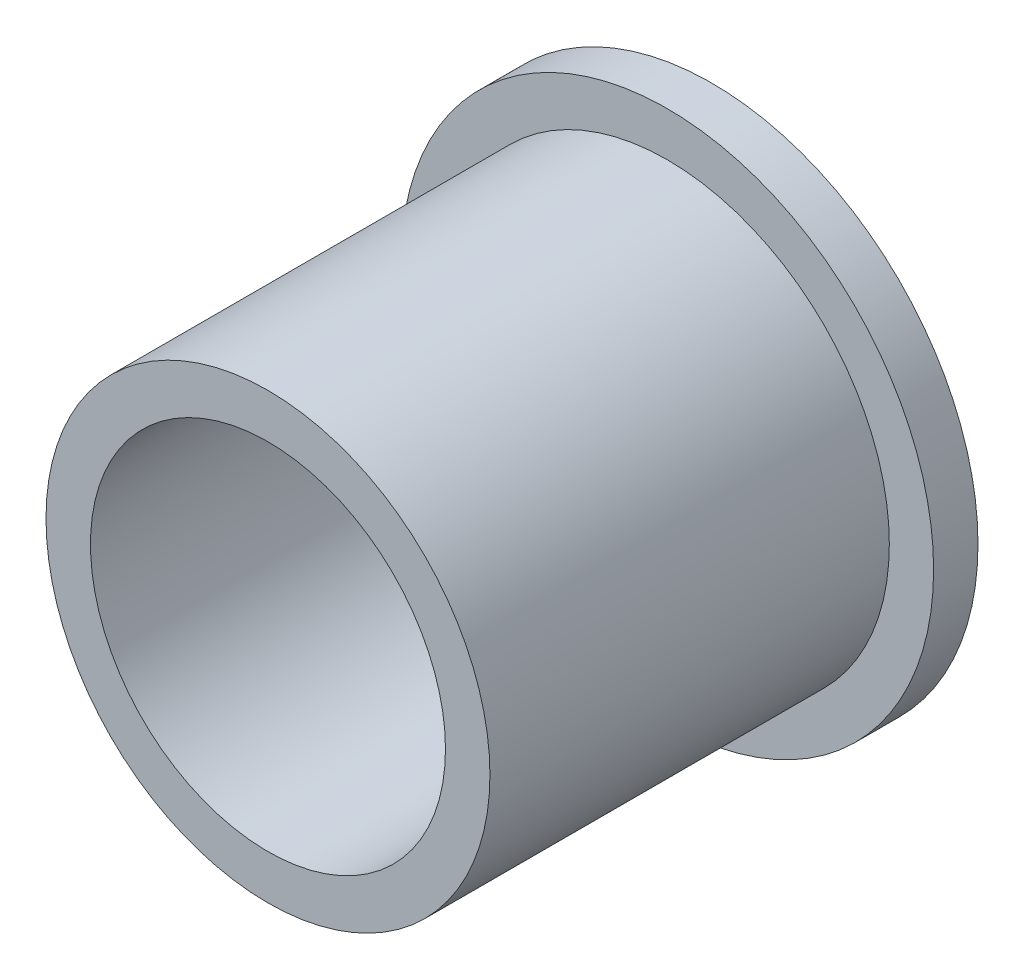
ISO-10303-21;
HEADER;
FILE_DESCRIPTION(('STEP AP214'),'2;1');
FILE_NAME('part.step','',(''),(''),'','','');
FILE_SCHEMA(('AUTOMOTIVE_DESIGN { 1 0 10303 214 1 1 1 1 }'));
ENDSEC;
DATA;
#1=APPLICATION_CONTEXT('core data for automotive mechanical design processes');
#2=APPLICATION_PROTOCOL_DEFINITION('international standard','automotive_design',2000,#1);
#3=PRODUCT_CONTEXT('',#1,'mechanical');
#4=PRODUCT('Part','Part','',(#3));
#5=PRODUCT_RELATED_PRODUCT_CATEGORY('part','',(#4));
#6=PRODUCT_DEFINITION_FORMATION('','',#4);
#7=PRODUCT_DEFINITION_CONTEXT('part definition',#1,'design');
#8=PRODUCT_DEFINITION('design','',#6,#7);
#9=PRODUCT_DEFINITION_SHAPE('','',#8);
#10=(LENGTH_UNIT() NAMED_UNIT(*) SI_UNIT(.MILLI.,.METRE.));
#11=(NAMED_UNIT(*) PLANE_ANGLE_UNIT() SI_UNIT($,.RADIAN.));
#12=(NAMED_UNIT(*) SI_UNIT($,.STERADIAN.) SOLID_ANGLE_UNIT());
#13=UNCERTAINTY_MEASURE_WITH_UNIT(LENGTH_MEASURE(1.E-05),#10,'distance_accuracy_value','');
#14=(GEOMETRIC_REPRESENTATION_CONTEXT(3) GLOBAL_UNCERTAINTY_ASSIGNED_CONTEXT((#13)) GLOBAL_UNIT_ASSIGNED_CONTEXT((#10,
#11,#12)) REPRESENTATION_CONTEXT('',''));
#15=CARTESIAN_POINT('',(0.,0.,0.));
#16=DIRECTION('',(0.,0.,1.));
#17=DIRECTION('',(1.,0.,0.));
#18=AXIS2_PLACEMENT_3D('',#15,#16,#17);
#19=CARTESIAN_POINT('',(0.,0.,-15.875));
#20=DIRECTION('',(0.,0.,1.));
#21=DIRECTION('',(-1.,0.,0.));
#22=AXIS2_PLACEMENT_3D('',#19,#20,#21);
#23=CYLINDRICAL_SURFACE('',#22,15.88135);
#24=CARTESIAN_POINT('',(0.,0.,15.875));
#25=DIRECTION('',(0.,0.,1.));
#26=DIRECTION('',(1.,0.,0.));
#27=AXIS2_PLACEMENT_3D('',#24,#25,#26);
#28=CIRCLE('',#27,15.88135);
#29=CARTESIAN_POINT('',(15.88135,0.,15.875));
#30=VERTEX_POINT('',#29);
#31=EDGE_CURVE('E46',#30,#30,#28,.T.);
#32=ORIENTED_EDGE('',*,*,#31,.F.);
#33=EDGE_LOOP('',(#32));
#34=FACE_BOUND('',#33,.T.);
#35=CARTESIAN_POINT('',(0.,0.,-12.7));
#36=DIRECTION('',(0.,0.,1.));
#37=DIRECTION('',(1.,0.,0.));
#38=AXIS2_PLACEMENT_3D('',#35,#36,#37);
#39=CIRCLE('',#38,15.88135);
#40=CARTESIAN_POINT('',(15.88135,0.,-12.7));
#41=VERTEX_POINT('',#40);
#42=EDGE_CURVE('E10',#41,#41,#39,.T.);
#43=ORIENTED_EDGE('',*,*,#42,.T.);
#44=EDGE_LOOP('',(#43));
#45=FACE_BOUND('',#44,.T.);
#46=ADVANCED_FACE('F35',(#34,#45),#23,.T.);
#47=CARTESIAN_POINT('',(0.,0.,-15.875));
#48=DIRECTION('',(0.,0.,-1.));
#49=DIRECTION('',(1.,0.,0.));
#50=AXIS2_PLACEMENT_3D('',#47,#48,#49);
#51=PLANE('',#50);
#52=CARTESIAN_POINT('',(0.,0.,-15.875));
#53=DIRECTION('',(0.,0.,1.));
#54=DIRECTION('',(1.,0.,0.));
#55=AXIS2_PLACEMENT_3D('',#52,#53,#54);
#56=CIRCLE('',#55,12.7);
#57=CARTESIAN_POINT('',(12.7,0.,-15.875));
#58=VERTEX_POINT('',#57);
#59=EDGE_CURVE('E38',#58,#58,#56,.T.);
#60=ORIENTED_EDGE('',*,*,#59,.T.);
#61=EDGE_LOOP('',(#60));
#62=FACE_BOUND('',#61,.T.);
#63=CARTESIAN_POINT('',(0.,0.,-15.875));
#64=DIRECTION('',(0.,0.,1.));
#65=DIRECTION('',(1.,0.,0.));
#66=AXIS2_PLACEMENT_3D('',#63,#64,#65);
#67=CIRCLE('',#66,19.05);
#68=CARTESIAN_POINT('',(19.05,0.,-15.875));
#69=VERTEX_POINT('',#68);
#70=EDGE_CURVE('E53',#69,#69,#67,.T.);
#71=ORIENTED_EDGE('',*,*,#70,.F.);
#72=EDGE_LOOP('',(#71));
#73=FACE_BOUND('',#72,.T.);
#74=ADVANCED_FACE('F60',(#62,#73),#51,.T.);
#75=CARTESIAN_POINT('',(0.,0.,-15.875));
#76=DIRECTION('',(0.,0.,1.));
#77=DIRECTION('',(-1.,0.,0.));
#78=AXIS2_PLACEMENT_3D('',#75,#76,#77);
#79=CYLINDRICAL_SURFACE('',#78,12.7);
#80=ORIENTED_EDGE('',*,*,#59,.F.);
#81=EDGE_LOOP('',(#80));
#82=FACE_BOUND('',#81,.T.);
#83=CARTESIAN_POINT('',(0.,0.,15.875));
#84=DIRECTION('',(0.,0.,1.));
#85=DIRECTION('',(1.,0.,0.));
#86=AXIS2_PLACEMENT_3D('',#83,#84,#85);
#87=CIRCLE('',#86,12.7);
#88=CARTESIAN_POINT('',(12.7,0.,15.875));
#89=VERTEX_POINT('',#88);
#90=EDGE_CURVE('E51',#89,#89,#87,.T.);
#91=ORIENTED_EDGE('',*,*,#90,.T.);
#92=EDGE_LOOP('',(#91));
#93=FACE_BOUND('',#92,.T.);
#94=ADVANCED_FACE('F64',(#82,#93),#79,.F.);
#95=CARTESIAN_POINT('',(0.,0.,15.875));
#96=DIRECTION('',(0.,0.,-1.));
#97=DIRECTION('',(1.,0.,0.));
#98=AXIS2_PLACEMENT_3D('',#95,#96,#97);
#99=PLANE('',#98);
#100=ORIENTED_EDGE('',*,*,#90,.F.);
#101=EDGE_LOOP('',(#100));
#102=FACE_BOUND('',#101,.T.);
#103=ORIENTED_EDGE('',*,*,#31,.T.);
#104=EDGE_LOOP('',(#103));
#105=FACE_BOUND('',#104,.T.);
#106=ADVANCED_FACE('F57',(#102,#105),#99,.F.);
#107=CARTESIAN_POINT('',(0.,0.,-12.7));
#108=DIRECTION('',(0.,0.,-1.));
#109=DIRECTION('',(1.,0.,0.));
#110=AXIS2_PLACEMENT_3D('',#107,#108,#109);
#111=PLANE('',#110);
#112=CARTESIAN_POINT('',(0.,0.,-12.7));
#113=DIRECTION('',(0.,0.,1.));
#114=DIRECTION('',(1.,0.,0.));
#115=AXIS2_PLACEMENT_3D('',#112,#113,#114);
#116=CIRCLE('',#115,19.05);
#117=CARTESIAN_POINT('',(19.05,0.,-12.7));
#118=VERTEX_POINT('',#117);
#119=EDGE_CURVE('E49',#118,#118,#116,.T.);
#120=ORIENTED_EDGE('',*,*,#119,.T.);
#121=EDGE_LOOP('',(#120));
#122=FACE_BOUND('',#121,.T.);
#123=ORIENTED_EDGE('',*,*,#42,.F.);
#124=EDGE_LOOP('',(#123));
#125=FACE_BOUND('',#124,.T.);
#126=ADVANCED_FACE('F75',(#122,#125),#111,.F.);
#127=CARTESIAN_POINT('',(0.,0.,-15.875));
#128=DIRECTION('',(0.,0.,1.));
#129=DIRECTION('',(-1.,0.,0.));
#130=AXIS2_PLACEMENT_3D('',#127,#128,#129);
#131=CYLINDRICAL_SURFACE('',#130,19.05);
#132=ORIENTED_EDGE('',*,*,#70,.T.);
#133=EDGE_LOOP('',(#132));
#134=FACE_BOUND('',#133,.T.);
#135=ORIENTED_EDGE('',*,*,#119,.F.);
#136=EDGE_LOOP('',(#135));
#137=FACE_BOUND('',#136,.T.);
#138=ADVANCED_FACE('F77',(#134,#137),#131,.T.);
#139=CLOSED_SHELL('',(#46,#74,#94,#106,#126,#138));
#140=MANIFOLD_SOLID_BREP('B2',#139);
#141=ADVANCED_BREP_SHAPE_REPRESENTATION('',(#18,#140),#14);
#142=SHAPE_DEFINITION_REPRESENTATION(#9,#141);
ENDSEC;
END-ISO-10303-21;
